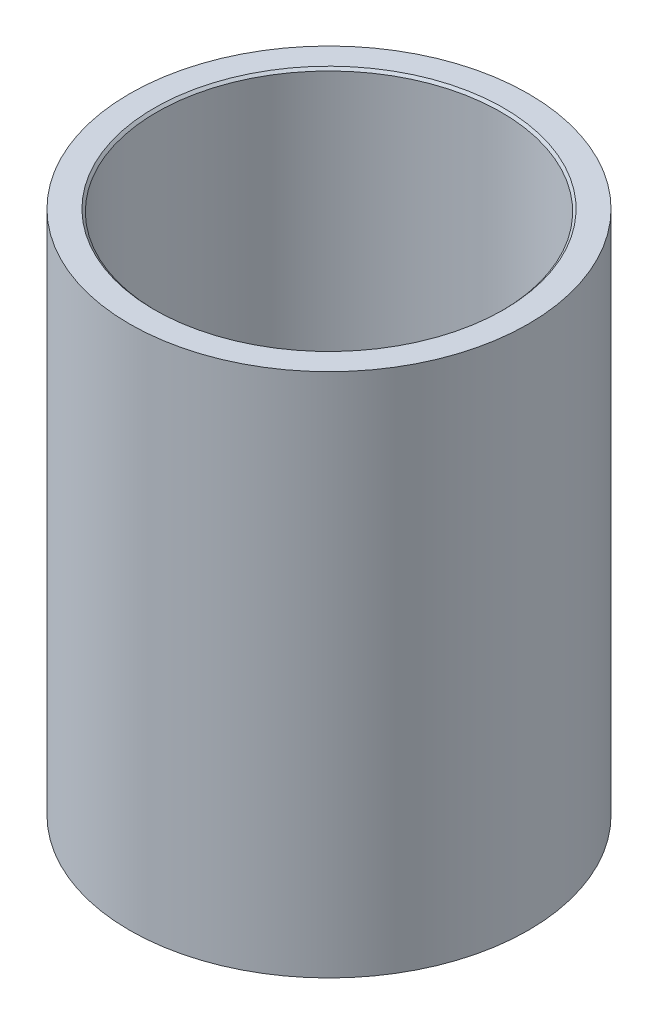
ISO-10303-21;
HEADER;
FILE_DESCRIPTION(('STEP AP214'),'2;1');
FILE_NAME('part.step','',(''),(''),'','','');
FILE_SCHEMA(('AUTOMOTIVE_DESIGN { 1 0 10303 214 1 1 1 1 }'));
ENDSEC;
DATA;
#1=APPLICATION_CONTEXT('core data for automotive mechanical design processes');
#2=APPLICATION_PROTOCOL_DEFINITION('international standard','automotive_design',2000,#1);
#3=PRODUCT_CONTEXT('',#1,'mechanical');
#4=PRODUCT('Part','Part','',(#3));
#5=PRODUCT_RELATED_PRODUCT_CATEGORY('part','',(#4));
#6=PRODUCT_DEFINITION_FORMATION('','',#4);
#7=PRODUCT_DEFINITION_CONTEXT('part definition',#1,'design');
#8=PRODUCT_DEFINITION('design','',#6,#7);
#9=PRODUCT_DEFINITION_SHAPE('','',#8);
#10=(LENGTH_UNIT() NAMED_UNIT(*) SI_UNIT(.MILLI.,.METRE.));
#11=(NAMED_UNIT(*) PLANE_ANGLE_UNIT() SI_UNIT($,.RADIAN.));
#12=(NAMED_UNIT(*) SI_UNIT($,.STERADIAN.) SOLID_ANGLE_UNIT());
#13=UNCERTAINTY_MEASURE_WITH_UNIT(LENGTH_MEASURE(1.E-05),#10,'distance_accuracy_value','');
#14=(GEOMETRIC_REPRESENTATION_CONTEXT(3) GLOBAL_UNCERTAINTY_ASSIGNED_CONTEXT((#13)) GLOBAL_UNIT_ASSIGNED_CONTEXT((#10,
#11,#12)) REPRESENTATION_CONTEXT('',''));
#15=CARTESIAN_POINT('',(0.,0.,0.));
#16=DIRECTION('',(0.,0.,1.));
#17=DIRECTION('',(1.,0.,0.));
#18=AXIS2_PLACEMENT_3D('',#15,#16,#17);
#19=CARTESIAN_POINT('',(0.,0.,0.));
#20=DIRECTION('',(0.,1.,0.));
#21=DIRECTION('',(-1.,0.,0.));
#22=AXIS2_PLACEMENT_3D('',#19,#20,#21);
#23=PLANE('',#22);
#24=CARTESIAN_POINT('',(0.,0.,0.));
#25=DIRECTION('',(0.,1.,0.));
#26=DIRECTION('',(-1.,0.,0.));
#27=AXIS2_PLACEMENT_3D('',#24,#25,#26);
#28=CIRCLE('',#27,29.4);
#29=CARTESIAN_POINT('',(-29.4,0.,0.));
#30=VERTEX_POINT('',#29);
#31=EDGE_CURVE('E98',#30,#30,#28,.T.);
#32=ORIENTED_EDGE('',*,*,#31,.F.);
#33=EDGE_LOOP('',(#32));
#34=FACE_BOUND('',#33,.T.);
#35=ADVANCED_FACE('F69',(#34),#23,.F.);
#36=CARTESIAN_POINT('',(0.,3.99999999999999,0.));
#37=DIRECTION('',(0.,1.,0.));
#38=DIRECTION('',(-1.,0.,0.));
#39=AXIS2_PLACEMENT_3D('',#36,#37,#38);
#40=CYLINDRICAL_SURFACE('',#39,29.4);
#41=CARTESIAN_POINT('',(0.,77.4,0.));
#42=DIRECTION('',(0.,1.,0.));
#43=DIRECTION('',(-1.,0.,0.));
#44=AXIS2_PLACEMENT_3D('',#41,#42,#43);
#45=CIRCLE('',#44,29.4);
#46=CARTESIAN_POINT('',(-29.4,77.4,0.));
#47=VERTEX_POINT('',#46);
#48=EDGE_CURVE('E102',#47,#47,#45,.T.);
#49=ORIENTED_EDGE('',*,*,#48,.F.);
#50=EDGE_LOOP('',(#49));
#51=FACE_BOUND('',#50,.T.);
#52=ORIENTED_EDGE('',*,*,#31,.T.);
#53=EDGE_LOOP('',(#52));
#54=FACE_BOUND('',#53,.T.);
#55=ADVANCED_FACE('F111',(#51,#54),#40,.T.);
#56=CARTESIAN_POINT('',(29.4,77.4,0.));
#57=DIRECTION('',(0.,-1.,0.));
#58=DIRECTION('',(1.,0.,0.));
#59=AXIS2_PLACEMENT_3D('',#56,#57,#58);
#60=PLANE('',#59);
#61=CARTESIAN_POINT('',(0.,77.4,0.));
#62=DIRECTION('',(0.,-1.,0.));
#63=DIRECTION('',(1.,0.,0.));
#64=AXIS2_PLACEMENT_3D('',#61,#62,#63);
#65=CIRCLE('',#64,25.7569);
#66=CARTESIAN_POINT('',(25.7569,77.4,0.));
#67=VERTEX_POINT('',#66);
#68=EDGE_CURVE('E11',#67,#67,#65,.T.);
#69=ORIENTED_EDGE('',*,*,#68,.T.);
#70=EDGE_LOOP('',(#69));
#71=FACE_BOUND('',#70,.T.);
#72=ORIENTED_EDGE('',*,*,#48,.T.);
#73=EDGE_LOOP('',(#72));
#74=FACE_BOUND('',#73,.T.);
#75=ADVANCED_FACE('F109',(#71,#74),#60,.F.);
#76=CARTESIAN_POINT('',(0.,3.99999999999999,0.));
#77=DIRECTION('',(0.,1.,0.));
#78=DIRECTION('',(-1.,0.,0.));
#79=AXIS2_PLACEMENT_3D('',#76,#77,#78);
#80=CYLINDRICAL_SURFACE('',#79,25.4);
#81=CARTESIAN_POINT('',(0.,77.0431,0.));
#82=DIRECTION('',(0.,-1.,0.));
#83=DIRECTION('',(1.,0.,0.));
#84=AXIS2_PLACEMENT_3D('',#81,#82,#83);
#85=CIRCLE('',#84,25.4);
#86=CARTESIAN_POINT('',(25.4,77.0431,0.));
#87=VERTEX_POINT('',#86);
#88=EDGE_CURVE('E78',#87,#87,#85,.F.);
#89=ORIENTED_EDGE('',*,*,#88,.T.);
#90=EDGE_LOOP('',(#89));
#91=FACE_BOUND('',#90,.T.);
#92=CARTESIAN_POINT('',(0.,8.,0.));
#93=DIRECTION('',(0.,-1.,0.));
#94=DIRECTION('',(1.,0.,0.));
#95=AXIS2_PLACEMENT_3D('',#92,#93,#94);
#96=CIRCLE('',#95,25.4);
#97=CARTESIAN_POINT('',(25.4,8.,0.));
#98=VERTEX_POINT('',#97);
#99=EDGE_CURVE('E85',#98,#98,#96,.T.);
#100=ORIENTED_EDGE('',*,*,#99,.T.);
#101=EDGE_LOOP('',(#100));
#102=FACE_BOUND('',#101,.T.);
#103=ADVANCED_FACE('F132',(#91,#102),#80,.F.);
#104=CARTESIAN_POINT('',(25.4,4.,0.));
#105=DIRECTION('',(0.,-1.,0.));
#106=DIRECTION('',(1.,0.,0.));
#107=AXIS2_PLACEMENT_3D('',#104,#105,#106);
#108=PLANE('',#107);
#109=CARTESIAN_POINT('',(0.,4.,0.));
#110=DIRECTION('',(0.,-1.,0.));
#111=DIRECTION('',(1.,0.,0.));
#112=AXIS2_PLACEMENT_3D('',#109,#110,#111);
#113=CIRCLE('',#112,21.4);
#114=CARTESIAN_POINT('',(21.4,4.,0.));
#115=VERTEX_POINT('',#114);
#116=EDGE_CURVE('E92',#115,#115,#113,.F.);
#117=ORIENTED_EDGE('',*,*,#116,.T.);
#118=EDGE_LOOP('',(#117));
#119=FACE_BOUND('',#118,.T.);
#120=ADVANCED_FACE('F124',(#119),#108,.F.);
#121=CARTESIAN_POINT('',(0.,8.,0.));
#122=DIRECTION('',(0.,-1.,0.));
#123=DIRECTION('',(1.,0.,0.));
#124=AXIS2_PLACEMENT_3D('',#121,#122,#123);
#125=TOROIDAL_SURFACE('',#124,21.4,4.);
#126=ORIENTED_EDGE('',*,*,#99,.F.);
#127=EDGE_LOOP('',(#126));
#128=FACE_BOUND('',#127,.T.);
#129=ORIENTED_EDGE('',*,*,#116,.F.);
#130=EDGE_LOOP('',(#129));
#131=FACE_BOUND('',#130,.T.);
#132=ADVANCED_FACE('F122',(#128,#131),#125,.F.);
#133=CARTESIAN_POINT('',(0.,77.0431,0.));
#134=DIRECTION('',(0.,1.,0.));
#135=DIRECTION('',(-1.,0.,0.));
#136=AXIS2_PLACEMENT_3D('',#133,#134,#135);
#137=CONICAL_SURFACE('',#136,25.4,0.785398163397453);
#138=ORIENTED_EDGE('',*,*,#68,.F.);
#139=EDGE_LOOP('',(#138));
#140=FACE_BOUND('',#139,.T.);
#141=ORIENTED_EDGE('',*,*,#88,.F.);
#142=EDGE_LOOP('',(#141));
#143=FACE_BOUND('',#142,.T.);
#144=ADVANCED_FACE('F72',(#140,#143),#137,.F.);
#145=CLOSED_SHELL('',(#35,#55,#75,#103,#120,#132,#144));
#146=MANIFOLD_SOLID_BREP('B2',#145);
#147=ADVANCED_BREP_SHAPE_REPRESENTATION('',(#18,#146),#14);
#148=SHAPE_DEFINITION_REPRESENTATION(#9,#147);
ENDSEC;
END-ISO-10303-21;
